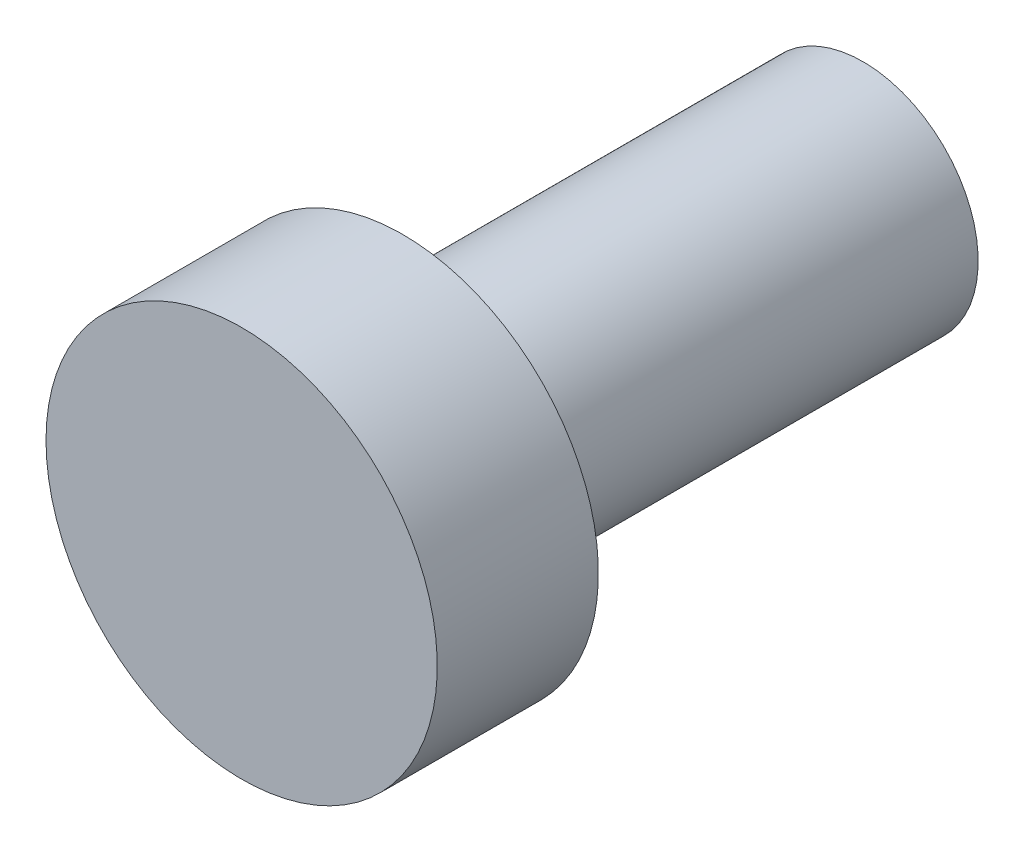
ISO-10303-21;
HEADER;
FILE_DESCRIPTION(('STEP AP214'),'2;1');
FILE_NAME('part.step','',(''),(''),'','','');
FILE_SCHEMA(('AUTOMOTIVE_DESIGN { 1 0 10303 214 1 1 1 1 }'));
ENDSEC;
DATA;
#1=APPLICATION_CONTEXT('core data for automotive mechanical design processes');
#2=APPLICATION_PROTOCOL_DEFINITION('international standard','automotive_design',2000,#1);
#3=PRODUCT_CONTEXT('',#1,'mechanical');
#4=PRODUCT('Part','Part','',(#3));
#5=PRODUCT_RELATED_PRODUCT_CATEGORY('part','',(#4));
#6=PRODUCT_DEFINITION_FORMATION('','',#4);
#7=PRODUCT_DEFINITION_CONTEXT('part definition',#1,'design');
#8=PRODUCT_DEFINITION('design','',#6,#7);
#9=PRODUCT_DEFINITION_SHAPE('','',#8);
#10=(LENGTH_UNIT() NAMED_UNIT(*) SI_UNIT(.MILLI.,.METRE.));
#11=(NAMED_UNIT(*) PLANE_ANGLE_UNIT() SI_UNIT($,.RADIAN.));
#12=(NAMED_UNIT(*) SI_UNIT($,.STERADIAN.) SOLID_ANGLE_UNIT());
#13=UNCERTAINTY_MEASURE_WITH_UNIT(LENGTH_MEASURE(1.E-05),#10,'distance_accuracy_value','');
#14=(GEOMETRIC_REPRESENTATION_CONTEXT(3) GLOBAL_UNCERTAINTY_ASSIGNED_CONTEXT((#13)) GLOBAL_UNIT_ASSIGNED_CONTEXT((#10,
#11,#12)) REPRESENTATION_CONTEXT('',''));
#15=CARTESIAN_POINT('',(0.,0.,0.));
#16=DIRECTION('',(0.,0.,1.));
#17=DIRECTION('',(1.,0.,0.));
#18=AXIS2_PLACEMENT_3D('',#15,#16,#17);
#19=CARTESIAN_POINT('',(0.,0.,3.5));
#20=DIRECTION('',(0.,0.,-1.));
#21=DIRECTION('',(-1.,0.,0.));
#22=AXIS2_PLACEMENT_3D('',#19,#20,#21);
#23=PLANE('',#22);
#24=CARTESIAN_POINT('',(0.,0.,3.5));
#25=DIRECTION('',(0.,0.,-1.));
#26=DIRECTION('',(-1.,0.,0.));
#27=AXIS2_PLACEMENT_3D('',#24,#25,#26);
#28=CIRCLE('',#27,4.25);
#29=CARTESIAN_POINT('',(-4.25000000000001,0.,3.5));
#30=VERTEX_POINT('',#29);
#31=EDGE_CURVE('E10',#30,#30,#28,.T.);
#32=ORIENTED_EDGE('',*,*,#31,.F.);
#33=EDGE_LOOP('',(#32));
#34=FACE_BOUND('',#33,.T.);
#35=ADVANCED_FACE('F34',(#34),#23,.F.);
#36=CARTESIAN_POINT('',(0.,0.,-10.));
#37=DIRECTION('',(0.,0.,-1.));
#38=DIRECTION('',(-1.,0.,0.));
#39=AXIS2_PLACEMENT_3D('',#36,#37,#38);
#40=CYLINDRICAL_SURFACE('',#39,4.25);
#41=CARTESIAN_POINT('',(0.,0.,0.));
#42=DIRECTION('',(0.,0.,-1.));
#43=DIRECTION('',(-1.,0.,0.));
#44=AXIS2_PLACEMENT_3D('',#41,#42,#43);
#45=CIRCLE('',#44,4.25);
#46=CARTESIAN_POINT('',(-4.25000000000001,0.,0.));
#47=VERTEX_POINT('',#46);
#48=EDGE_CURVE('E45',#47,#47,#45,.T.);
#49=ORIENTED_EDGE('',*,*,#48,.F.);
#50=EDGE_LOOP('',(#49));
#51=FACE_BOUND('',#50,.T.);
#52=ORIENTED_EDGE('',*,*,#31,.T.);
#53=EDGE_LOOP('',(#52));
#54=FACE_BOUND('',#53,.T.);
#55=ADVANCED_FACE('F75',(#51,#54),#40,.T.);
#56=CARTESIAN_POINT('',(4.25000000000001,0.,0.));
#57=DIRECTION('',(0.,0.,1.));
#58=DIRECTION('',(1.,0.,0.));
#59=AXIS2_PLACEMENT_3D('',#56,#57,#58);
#60=PLANE('',#59);
#61=CARTESIAN_POINT('',(0.,0.,0.));
#62=DIRECTION('',(0.,0.,-1.));
#63=DIRECTION('',(-1.,0.,0.));
#64=AXIS2_PLACEMENT_3D('',#61,#62,#63);
#65=CIRCLE('',#64,2.5);
#66=CARTESIAN_POINT('',(-2.5,0.,0.));
#67=VERTEX_POINT('',#66);
#68=EDGE_CURVE('E48',#67,#67,#65,.T.);
#69=ORIENTED_EDGE('',*,*,#68,.F.);
#70=EDGE_LOOP('',(#69));
#71=FACE_BOUND('',#70,.T.);
#72=ORIENTED_EDGE('',*,*,#48,.T.);
#73=EDGE_LOOP('',(#72));
#74=FACE_BOUND('',#73,.T.);
#75=ADVANCED_FACE('F67',(#71,#74),#60,.F.);
#76=CARTESIAN_POINT('',(0.,0.,-10.));
#77=DIRECTION('',(0.,0.,-1.));
#78=DIRECTION('',(-1.,0.,0.));
#79=AXIS2_PLACEMENT_3D('',#76,#77,#78);
#80=CYLINDRICAL_SURFACE('',#79,2.5);
#81=CARTESIAN_POINT('',(0.,0.,-10.));
#82=DIRECTION('',(0.,0.,-1.));
#83=DIRECTION('',(-1.,0.,0.));
#84=AXIS2_PLACEMENT_3D('',#81,#82,#83);
#85=CIRCLE('',#84,2.5);
#86=CARTESIAN_POINT('',(-2.5,0.,-10.));
#87=VERTEX_POINT('',#86);
#88=EDGE_CURVE('E53',#87,#87,#85,.T.);
#89=ORIENTED_EDGE('',*,*,#88,.F.);
#90=EDGE_LOOP('',(#89));
#91=FACE_BOUND('',#90,.T.);
#92=ORIENTED_EDGE('',*,*,#68,.T.);
#93=EDGE_LOOP('',(#92));
#94=FACE_BOUND('',#93,.T.);
#95=ADVANCED_FACE('F61',(#91,#94),#80,.T.);
#96=CARTESIAN_POINT('',(2.5,0.,-10.));
#97=DIRECTION('',(0.,0.,1.));
#98=DIRECTION('',(1.,0.,0.));
#99=AXIS2_PLACEMENT_3D('',#96,#97,#98);
#100=PLANE('',#99);
#101=ORIENTED_EDGE('',*,*,#88,.T.);
#102=EDGE_LOOP('',(#101));
#103=FACE_BOUND('',#102,.T.);
#104=ADVANCED_FACE('F65',(#103),#100,.F.);
#105=CLOSED_SHELL('',(#35,#55,#75,#95,#104));
#106=MANIFOLD_SOLID_BREP('B2',#105);
#107=ADVANCED_BREP_SHAPE_REPRESENTATION('',(#18,#106),#14);
#108=SHAPE_DEFINITION_REPRESENTATION(#9,#107);
ENDSEC;
END-ISO-10303-21;
